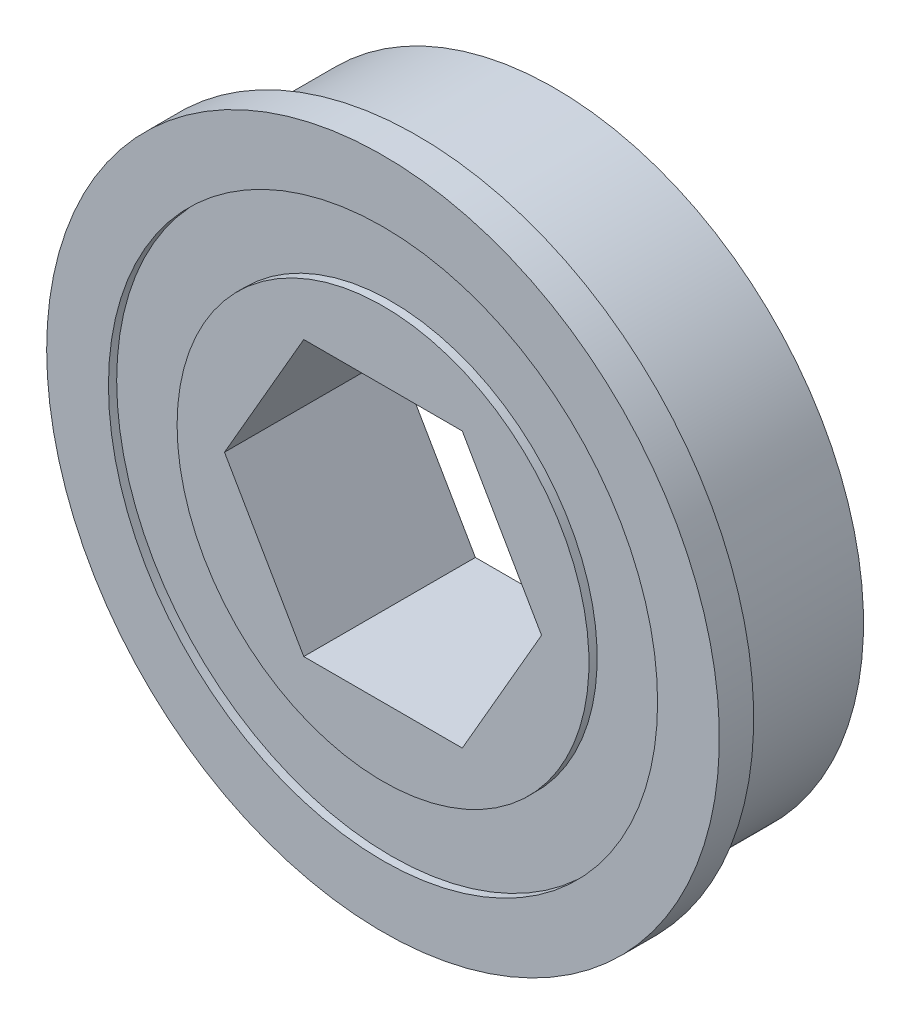
ISO-10303-21;
HEADER;
FILE_DESCRIPTION(('STEP AP214'),'2;1');
FILE_NAME('part.step','',(''),(''),'','','');
FILE_SCHEMA(('AUTOMOTIVE_DESIGN { 1 0 10303 214 1 1 1 1 }'));
ENDSEC;
DATA;
#1=APPLICATION_CONTEXT('core data for automotive mechanical design processes');
#2=APPLICATION_PROTOCOL_DEFINITION('international standard','automotive_design',2000,#1);
#3=PRODUCT_CONTEXT('',#1,'mechanical');
#4=PRODUCT('Part','Part','',(#3));
#5=PRODUCT_RELATED_PRODUCT_CATEGORY('part','',(#4));
#6=PRODUCT_DEFINITION_FORMATION('','',#4);
#7=PRODUCT_DEFINITION_CONTEXT('part definition',#1,'design');
#8=PRODUCT_DEFINITION('design','',#6,#7);
#9=PRODUCT_DEFINITION_SHAPE('','',#8);
#10=(LENGTH_UNIT() NAMED_UNIT(*) SI_UNIT(.MILLI.,.METRE.));
#11=(NAMED_UNIT(*) PLANE_ANGLE_UNIT() SI_UNIT($,.RADIAN.));
#12=(NAMED_UNIT(*) SI_UNIT($,.STERADIAN.) SOLID_ANGLE_UNIT());
#13=UNCERTAINTY_MEASURE_WITH_UNIT(LENGTH_MEASURE(1.E-05),#10,'distance_accuracy_value','');
#14=(GEOMETRIC_REPRESENTATION_CONTEXT(3) GLOBAL_UNCERTAINTY_ASSIGNED_CONTEXT((#13)) GLOBAL_UNIT_ASSIGNED_CONTEXT((#10,
#11,#12)) REPRESENTATION_CONTEXT('',''));
#15=CARTESIAN_POINT('',(0.,0.,0.));
#16=DIRECTION('',(0.,0.,1.));
#17=DIRECTION('',(1.,0.,0.));
#18=AXIS2_PLACEMENT_3D('',#15,#16,#17);
#19=CARTESIAN_POINT('',(7.9375,0.,0.));
#20=DIRECTION('',(0.,0.,1.));
#21=DIRECTION('',(1.,0.,0.));
#22=AXIS2_PLACEMENT_3D('',#19,#20,#21);
#23=PLANE('',#22);
#24=DIRECTION('',(0.5,0.866025403784438,0.));
#25=VECTOR('',#24,1.);
#26=CARTESIAN_POINT('',(7.48363631403119,0.262038321269491,0.));
#27=LINE('',#26,#25);
#28=CARTESIAN_POINT('',(3.66617420935412,-6.35,0.));
#29=VERTEX_POINT('',#28);
#30=CARTESIAN_POINT('',(7.33234841870825,0.,0.));
#31=VERTEX_POINT('',#30);
#32=EDGE_CURVE('E32',#29,#31,#27,.T.);
#33=ORIENTED_EDGE('',*,*,#32,.T.);
#34=DIRECTION('',(-0.5,0.866025403784439,0.));
#35=VECTOR('',#34,1.);
#36=CARTESIAN_POINT('',(7.48363631403119,-0.262038321269491,0.));
#37=LINE('',#36,#35);
#38=CARTESIAN_POINT('',(3.66617420935412,6.35,0.));
#39=VERTEX_POINT('',#38);
#40=EDGE_CURVE('E116',#31,#39,#37,.T.);
#41=ORIENTED_EDGE('',*,*,#40,.T.);
#42=DIRECTION('',(-1.,0.,0.));
#43=VECTOR('',#42,1.);
#44=CARTESIAN_POINT('',(7.9375,6.35,0.));
#45=LINE('',#44,#43);
#46=CARTESIAN_POINT('',(-3.66617420935412,6.35,0.));
#47=VERTEX_POINT('',#46);
#48=EDGE_CURVE('E113',#39,#47,#45,.T.);
#49=ORIENTED_EDGE('',*,*,#48,.T.);
#50=DIRECTION('',(-0.5,-0.866025403784439,0.));
#51=VECTOR('',#50,1.);
#52=CARTESIAN_POINT('',(-3.51488631403119,6.61203832126949,0.));
#53=LINE('',#52,#51);
#54=CARTESIAN_POINT('',(-7.33234841870825,0.,0.));
#55=VERTEX_POINT('',#54);
#56=EDGE_CURVE('E110',#47,#55,#53,.T.);
#57=ORIENTED_EDGE('',*,*,#56,.T.);
#58=DIRECTION('',(0.5,-0.866025403784439,0.));
#59=VECTOR('',#58,1.);
#60=CARTESIAN_POINT('',(-3.51488631403119,-6.61203832126949,0.));
#61=LINE('',#60,#59);
#62=CARTESIAN_POINT('',(-3.66617420935412,-6.35,0.));
#63=VERTEX_POINT('',#62);
#64=EDGE_CURVE('E71',#55,#63,#61,.T.);
#65=ORIENTED_EDGE('',*,*,#64,.T.);
#66=DIRECTION('',(1.,0.,0.));
#67=VECTOR('',#66,1.);
#68=CARTESIAN_POINT('',(7.9375,-6.35,0.));
#69=LINE('',#68,#67);
#70=EDGE_CURVE('E68',#63,#29,#69,.T.);
#71=ORIENTED_EDGE('',*,*,#70,.T.);
#72=EDGE_LOOP('',(#33,#41,#49,#57,#65,#71));
#73=FACE_BOUND('',#72,.T.);
#74=CARTESIAN_POINT('',(0.,0.,0.));
#75=DIRECTION('',(0.,0.,-1.));
#76=DIRECTION('',(-1.,0.,0.));
#77=AXIS2_PLACEMENT_3D('',#74,#75,#76);
#78=CIRCLE('',#77,9.525);
#79=CARTESIAN_POINT('',(-9.525,0.,0.));
#80=VERTEX_POINT('',#79);
#81=EDGE_CURVE('E163',#80,#80,#78,.T.);
#82=ORIENTED_EDGE('',*,*,#81,.T.);
#83=EDGE_LOOP('',(#82));
#84=FACE_BOUND('',#83,.T.);
#85=ADVANCED_FACE('F17',(#73,#84),#23,.F.);
#86=CARTESIAN_POINT('',(0.,0.,0.));
#87=DIRECTION('',(0.,0.,-1.));
#88=DIRECTION('',(-1.,0.,0.));
#89=AXIS2_PLACEMENT_3D('',#86,#87,#88);
#90=CYLINDRICAL_SURFACE('',#89,9.525);
#91=ORIENTED_EDGE('',*,*,#81,.F.);
#92=EDGE_LOOP('',(#91));
#93=FACE_BOUND('',#92,.T.);
#94=CARTESIAN_POINT('',(0.,0.,0.381));
#95=DIRECTION('',(0.,0.,-1.));
#96=DIRECTION('',(-1.,0.,0.));
#97=AXIS2_PLACEMENT_3D('',#94,#95,#96);
#98=CIRCLE('',#97,9.525);
#99=CARTESIAN_POINT('',(-9.525,0.,0.381));
#100=VERTEX_POINT('',#99);
#101=EDGE_CURVE('E159',#100,#100,#98,.T.);
#102=ORIENTED_EDGE('',*,*,#101,.T.);
#103=EDGE_LOOP('',(#102));
#104=FACE_BOUND('',#103,.T.);
#105=ADVANCED_FACE('F207',(#93,#104),#90,.T.);
#106=CARTESIAN_POINT('',(11.1125,0.,0.381));
#107=DIRECTION('',(0.,0.,1.));
#108=DIRECTION('',(1.,0.,0.));
#109=AXIS2_PLACEMENT_3D('',#106,#107,#108);
#110=PLANE('',#109);
#111=ORIENTED_EDGE('',*,*,#101,.F.);
#112=EDGE_LOOP('',(#111));
#113=FACE_BOUND('',#112,.T.);
#114=CARTESIAN_POINT('',(0.,0.,0.381));
#115=DIRECTION('',(0.,0.,-1.));
#116=DIRECTION('',(-1.,0.,0.));
#117=AXIS2_PLACEMENT_3D('',#114,#115,#116);
#118=CIRCLE('',#117,12.7);
#119=CARTESIAN_POINT('',(-12.7,0.,0.381));
#120=VERTEX_POINT('',#119);
#121=EDGE_CURVE('E155',#120,#120,#118,.T.);
#122=ORIENTED_EDGE('',*,*,#121,.T.);
#123=EDGE_LOOP('',(#122));
#124=FACE_BOUND('',#123,.T.);
#125=ADVANCED_FACE('F210',(#113,#124),#110,.F.);
#126=CARTESIAN_POINT('',(0.,0.,0.));
#127=DIRECTION('',(0.,0.,-1.));
#128=DIRECTION('',(-1.,0.,0.));
#129=AXIS2_PLACEMENT_3D('',#126,#127,#128);
#130=CYLINDRICAL_SURFACE('',#129,12.7);
#131=ORIENTED_EDGE('',*,*,#121,.F.);
#132=EDGE_LOOP('',(#131));
#133=FACE_BOUND('',#132,.T.);
#134=CARTESIAN_POINT('',(0.,0.,0.));
#135=DIRECTION('',(0.,0.,-1.));
#136=DIRECTION('',(-1.,0.,0.));
#137=AXIS2_PLACEMENT_3D('',#134,#135,#136);
#138=CIRCLE('',#137,12.7);
#139=CARTESIAN_POINT('',(-12.7,0.,0.));
#140=VERTEX_POINT('',#139);
#141=EDGE_CURVE('E151',#140,#140,#138,.T.);
#142=ORIENTED_EDGE('',*,*,#141,.T.);
#143=EDGE_LOOP('',(#142));
#144=FACE_BOUND('',#143,.T.);
#145=ADVANCED_FACE('F215',(#133,#144),#130,.F.);
#146=CARTESIAN_POINT('',(13.49375,0.,0.));
#147=DIRECTION('',(0.,0.,1.));
#148=DIRECTION('',(1.,0.,0.));
#149=AXIS2_PLACEMENT_3D('',#146,#147,#148);
#150=PLANE('',#149);
#151=ORIENTED_EDGE('',*,*,#141,.F.);
#152=EDGE_LOOP('',(#151));
#153=FACE_BOUND('',#152,.T.);
#154=CARTESIAN_POINT('',(0.,0.,0.));
#155=DIRECTION('',(0.,0.,-1.));
#156=DIRECTION('',(-1.,0.,0.));
#157=AXIS2_PLACEMENT_3D('',#154,#155,#156);
#158=CIRCLE('',#157,14.2875);
#159=CARTESIAN_POINT('',(-14.2875,0.,0.));
#160=VERTEX_POINT('',#159);
#161=EDGE_CURVE('E147',#160,#160,#158,.T.);
#162=ORIENTED_EDGE('',*,*,#161,.T.);
#163=EDGE_LOOP('',(#162));
#164=FACE_BOUND('',#163,.T.);
#165=ADVANCED_FACE('F223',(#153,#164),#150,.F.);
#166=CARTESIAN_POINT('',(0.,0.,0.));
#167=DIRECTION('',(0.,0.,-1.));
#168=DIRECTION('',(-1.,0.,0.));
#169=AXIS2_PLACEMENT_3D('',#166,#167,#168);
#170=CYLINDRICAL_SURFACE('',#169,14.2875);
#171=ORIENTED_EDGE('',*,*,#161,.F.);
#172=EDGE_LOOP('',(#171));
#173=FACE_BOUND('',#172,.T.);
#174=CARTESIAN_POINT('',(0.,0.,6.35));
#175=DIRECTION('',(0.,0.,-1.));
#176=DIRECTION('',(-1.,0.,0.));
#177=AXIS2_PLACEMENT_3D('',#174,#175,#176);
#178=CIRCLE('',#177,14.2875);
#179=CARTESIAN_POINT('',(-14.2875,0.,6.35));
#180=VERTEX_POINT('',#179);
#181=EDGE_CURVE('E143',#180,#180,#178,.T.);
#182=ORIENTED_EDGE('',*,*,#181,.T.);
#183=EDGE_LOOP('',(#182));
#184=FACE_BOUND('',#183,.T.);
#185=ADVANCED_FACE('F227',(#173,#184),#170,.T.);
#186=CARTESIAN_POINT('',(14.9225,0.,6.35));
#187=DIRECTION('',(0.,0.,1.));
#188=DIRECTION('',(1.,0.,0.));
#189=AXIS2_PLACEMENT_3D('',#186,#187,#188);
#190=PLANE('',#189);
#191=ORIENTED_EDGE('',*,*,#181,.F.);
#192=EDGE_LOOP('',(#191));
#193=FACE_BOUND('',#192,.T.);
#194=CARTESIAN_POINT('',(0.,0.,6.35));
#195=DIRECTION('',(0.,0.,-1.));
#196=DIRECTION('',(-1.,0.,0.));
#197=AXIS2_PLACEMENT_3D('',#194,#195,#196);
#198=CIRCLE('',#197,15.5575);
#199=CARTESIAN_POINT('',(-15.5575,0.,6.35));
#200=VERTEX_POINT('',#199);
#201=EDGE_CURVE('E139',#200,#200,#198,.T.);
#202=ORIENTED_EDGE('',*,*,#201,.T.);
#203=EDGE_LOOP('',(#202));
#204=FACE_BOUND('',#203,.T.);
#205=ADVANCED_FACE('F231',(#193,#204),#190,.F.);
#206=CARTESIAN_POINT('',(0.,0.,0.));
#207=DIRECTION('',(0.,0.,-1.));
#208=DIRECTION('',(-1.,0.,0.));
#209=AXIS2_PLACEMENT_3D('',#206,#207,#208);
#210=CYLINDRICAL_SURFACE('',#209,15.5575);
#211=ORIENTED_EDGE('',*,*,#201,.F.);
#212=EDGE_LOOP('',(#211));
#213=FACE_BOUND('',#212,.T.);
#214=CARTESIAN_POINT('',(0.,0.,7.9375));
#215=DIRECTION('',(0.,0.,-1.));
#216=DIRECTION('',(-1.,0.,0.));
#217=AXIS2_PLACEMENT_3D('',#214,#215,#216);
#218=CIRCLE('',#217,15.5575);
#219=CARTESIAN_POINT('',(-15.5575,0.,7.9375));
#220=VERTEX_POINT('',#219);
#221=EDGE_CURVE('E135',#220,#220,#218,.T.);
#222=ORIENTED_EDGE('',*,*,#221,.T.);
#223=EDGE_LOOP('',(#222));
#224=FACE_BOUND('',#223,.T.);
#225=ADVANCED_FACE('F235',(#213,#224),#210,.T.);
#226=CARTESIAN_POINT('',(14.12875,0.,7.9375));
#227=DIRECTION('',(0.,0.,-1.));
#228=DIRECTION('',(-1.,0.,0.));
#229=AXIS2_PLACEMENT_3D('',#226,#227,#228);
#230=PLANE('',#229);
#231=ORIENTED_EDGE('',*,*,#221,.F.);
#232=EDGE_LOOP('',(#231));
#233=FACE_BOUND('',#232,.T.);
#234=CARTESIAN_POINT('',(0.,0.,7.9375));
#235=DIRECTION('',(0.,0.,-1.));
#236=DIRECTION('',(-1.,0.,0.));
#237=AXIS2_PLACEMENT_3D('',#234,#235,#236);
#238=CIRCLE('',#237,12.7);
#239=CARTESIAN_POINT('',(-12.7,0.,7.9375));
#240=VERTEX_POINT('',#239);
#241=EDGE_CURVE('E131',#240,#240,#238,.T.);
#242=ORIENTED_EDGE('',*,*,#241,.T.);
#243=EDGE_LOOP('',(#242));
#244=FACE_BOUND('',#243,.T.);
#245=ADVANCED_FACE('F239',(#233,#244),#230,.F.);
#246=CARTESIAN_POINT('',(0.,0.,0.));
#247=DIRECTION('',(0.,0.,-1.));
#248=DIRECTION('',(-1.,0.,0.));
#249=AXIS2_PLACEMENT_3D('',#246,#247,#248);
#250=CYLINDRICAL_SURFACE('',#249,12.7);
#251=ORIENTED_EDGE('',*,*,#241,.F.);
#252=EDGE_LOOP('',(#251));
#253=FACE_BOUND('',#252,.T.);
#254=CARTESIAN_POINT('',(0.,0.,7.5565));
#255=DIRECTION('',(0.,0.,-1.));
#256=DIRECTION('',(-1.,0.,0.));
#257=AXIS2_PLACEMENT_3D('',#254,#255,#256);
#258=CIRCLE('',#257,12.7);
#259=CARTESIAN_POINT('',(-12.7,0.,7.5565));
#260=VERTEX_POINT('',#259);
#261=EDGE_CURVE('E127',#260,#260,#258,.T.);
#262=ORIENTED_EDGE('',*,*,#261,.T.);
#263=EDGE_LOOP('',(#262));
#264=FACE_BOUND('',#263,.T.);
#265=ADVANCED_FACE('F243',(#253,#264),#250,.F.);
#266=CARTESIAN_POINT('',(11.1125,0.,7.5565));
#267=DIRECTION('',(0.,0.,-1.));
#268=DIRECTION('',(-1.,0.,0.));
#269=AXIS2_PLACEMENT_3D('',#266,#267,#268);
#270=PLANE('',#269);
#271=ORIENTED_EDGE('',*,*,#261,.F.);
#272=EDGE_LOOP('',(#271));
#273=FACE_BOUND('',#272,.T.);
#274=CARTESIAN_POINT('',(0.,0.,7.5565));
#275=DIRECTION('',(0.,0.,-1.));
#276=DIRECTION('',(-1.,0.,0.));
#277=AXIS2_PLACEMENT_3D('',#274,#275,#276);
#278=CIRCLE('',#277,9.525);
#279=CARTESIAN_POINT('',(-9.525,0.,7.5565));
#280=VERTEX_POINT('',#279);
#281=EDGE_CURVE('E123',#280,#280,#278,.T.);
#282=ORIENTED_EDGE('',*,*,#281,.T.);
#283=EDGE_LOOP('',(#282));
#284=FACE_BOUND('',#283,.T.);
#285=ADVANCED_FACE('F247',(#273,#284),#270,.F.);
#286=CARTESIAN_POINT('',(0.,0.,0.));
#287=DIRECTION('',(0.,0.,-1.));
#288=DIRECTION('',(-1.,0.,0.));
#289=AXIS2_PLACEMENT_3D('',#286,#287,#288);
#290=CYLINDRICAL_SURFACE('',#289,9.525);
#291=ORIENTED_EDGE('',*,*,#281,.F.);
#292=EDGE_LOOP('',(#291));
#293=FACE_BOUND('',#292,.T.);
#294=CARTESIAN_POINT('',(0.,0.,7.9375));
#295=DIRECTION('',(0.,0.,-1.));
#296=DIRECTION('',(-1.,0.,0.));
#297=AXIS2_PLACEMENT_3D('',#294,#295,#296);
#298=CIRCLE('',#297,9.525);
#299=CARTESIAN_POINT('',(-9.525,0.,7.9375));
#300=VERTEX_POINT('',#299);
#301=EDGE_CURVE('E119',#300,#300,#298,.T.);
#302=ORIENTED_EDGE('',*,*,#301,.T.);
#303=EDGE_LOOP('',(#302));
#304=FACE_BOUND('',#303,.T.);
#305=ADVANCED_FACE('F203',(#293,#304),#290,.T.);
#306=CARTESIAN_POINT('',(7.9375,0.,7.9375));
#307=DIRECTION('',(0.,0.,-1.));
#308=DIRECTION('',(-1.,0.,0.));
#309=AXIS2_PLACEMENT_3D('',#306,#307,#308);
#310=PLANE('',#309);
#311=ORIENTED_EDGE('',*,*,#301,.F.);
#312=EDGE_LOOP('',(#311));
#313=FACE_BOUND('',#312,.T.);
#314=DIRECTION('',(-0.5,0.866025403784439,0.));
#315=VECTOR('',#314,1.);
#316=CARTESIAN_POINT('',(-3.51488631403119,-6.61203832126949,7.9375));
#317=LINE('',#316,#315);
#318=CARTESIAN_POINT('',(-3.66617420935412,-6.35,7.9375));
#319=VERTEX_POINT('',#318);
#320=CARTESIAN_POINT('',(-7.33234841870825,0.,7.9375));
#321=VERTEX_POINT('',#320);
#322=EDGE_CURVE('E175',#319,#321,#317,.T.);
#323=ORIENTED_EDGE('',*,*,#322,.T.);
#324=DIRECTION('',(0.5,0.866025403784439,0.));
#325=VECTOR('',#324,1.);
#326=CARTESIAN_POINT('',(-3.51488631403119,6.61203832126949,7.9375));
#327=LINE('',#326,#325);
#328=CARTESIAN_POINT('',(-3.66617420935412,6.35,7.9375));
#329=VERTEX_POINT('',#328);
#330=EDGE_CURVE('E11',#321,#329,#327,.T.);
#331=ORIENTED_EDGE('',*,*,#330,.T.);
#332=DIRECTION('',(1.,0.,0.));
#333=VECTOR('',#332,1.);
#334=CARTESIAN_POINT('',(7.9375,6.35,7.9375));
#335=LINE('',#334,#333);
#336=CARTESIAN_POINT('',(3.66617420935412,6.35,7.9375));
#337=VERTEX_POINT('',#336);
#338=EDGE_CURVE('E25',#329,#337,#335,.T.);
#339=ORIENTED_EDGE('',*,*,#338,.T.);
#340=DIRECTION('',(0.5,-0.866025403784439,0.));
#341=VECTOR('',#340,1.);
#342=CARTESIAN_POINT('',(7.48363631403119,-0.26203832126949,7.9375));
#343=LINE('',#342,#341);
#344=CARTESIAN_POINT('',(7.33234841870825,0.,7.9375));
#345=VERTEX_POINT('',#344);
#346=EDGE_CURVE('E171',#337,#345,#343,.T.);
#347=ORIENTED_EDGE('',*,*,#346,.T.);
#348=DIRECTION('',(-0.5,-0.866025403784438,0.));
#349=VECTOR('',#348,1.);
#350=CARTESIAN_POINT('',(7.48363631403119,0.26203832126949,7.9375));
#351=LINE('',#350,#349);
#352=CARTESIAN_POINT('',(3.66617420935412,-6.35,7.9375));
#353=VERTEX_POINT('',#352);
#354=EDGE_CURVE('E167',#345,#353,#351,.T.);
#355=ORIENTED_EDGE('',*,*,#354,.T.);
#356=DIRECTION('',(-1.,0.,0.));
#357=VECTOR('',#356,1.);
#358=CARTESIAN_POINT('',(7.9375,-6.35,7.9375));
#359=LINE('',#358,#357);
#360=EDGE_CURVE('E85',#353,#319,#359,.T.);
#361=ORIENTED_EDGE('',*,*,#360,.T.);
#362=EDGE_LOOP('',(#323,#331,#339,#347,#355,#361));
#363=FACE_BOUND('',#362,.T.);
#364=ADVANCED_FACE('F181',(#313,#363),#310,.F.);
#365=CARTESIAN_POINT('',(5.49926131403119,3.175,-44.7234247877525));
#366=DIRECTION('',(0.866025403784439,0.5,0.));
#367=DIRECTION('',(-0.5,0.866025403784439,0.));
#368=AXIS2_PLACEMENT_3D('',#365,#366,#367);
#369=PLANE('',#368);
#370=ORIENTED_EDGE('',*,*,#40,.F.);
#371=DIRECTION('',(0.,0.,1.));
#372=VECTOR('',#371,1.);
#373=CARTESIAN_POINT('',(7.33234841870825,0.,-44.7234247877525));
#374=LINE('',#373,#372);
#375=EDGE_CURVE('E79',#31,#345,#374,.T.);
#376=ORIENTED_EDGE('',*,*,#375,.T.);
#377=ORIENTED_EDGE('',*,*,#346,.F.);
#378=DIRECTION('',(0.,0.,1.));
#379=VECTOR('',#378,1.);
#380=CARTESIAN_POINT('',(3.66617420935412,6.35,-44.7234247877525));
#381=LINE('',#380,#379);
#382=EDGE_CURVE('E82',#39,#337,#381,.T.);
#383=ORIENTED_EDGE('',*,*,#382,.F.);
#384=EDGE_LOOP('',(#370,#376,#377,#383));
#385=FACE_BOUND('',#384,.T.);
#386=ADVANCED_FACE('F195',(#385),#369,.F.);
#387=CARTESIAN_POINT('',(0.,6.35,-44.7234247877525));
#388=DIRECTION('',(0.,1.,0.));
#389=DIRECTION('',(0.,0.,1.));
#390=AXIS2_PLACEMENT_3D('',#387,#388,#389);
#391=PLANE('',#390);
#392=ORIENTED_EDGE('',*,*,#48,.F.);
#393=ORIENTED_EDGE('',*,*,#382,.T.);
#394=ORIENTED_EDGE('',*,*,#338,.F.);
#395=DIRECTION('',(0.,0.,1.));
#396=VECTOR('',#395,1.);
#397=CARTESIAN_POINT('',(-3.66617420935412,6.35,-44.7234247877525));
#398=LINE('',#397,#396);
#399=EDGE_CURVE('E101',#47,#329,#398,.T.);
#400=ORIENTED_EDGE('',*,*,#399,.F.);
#401=EDGE_LOOP('',(#392,#393,#394,#400));
#402=FACE_BOUND('',#401,.T.);
#403=ADVANCED_FACE('F185',(#402),#391,.F.);
#404=CARTESIAN_POINT('',(-5.49926131403119,3.175,-44.7234247877525));
#405=DIRECTION('',(-0.866025403784439,0.5,0.));
#406=DIRECTION('',(-0.5,-0.866025403784439,0.));
#407=AXIS2_PLACEMENT_3D('',#404,#405,#406);
#408=PLANE('',#407);
#409=ORIENTED_EDGE('',*,*,#56,.F.);
#410=ORIENTED_EDGE('',*,*,#399,.T.);
#411=ORIENTED_EDGE('',*,*,#330,.F.);
#412=DIRECTION('',(0.,0.,1.));
#413=VECTOR('',#412,1.);
#414=CARTESIAN_POINT('',(-7.33234841870825,0.,-44.7234247877525));
#415=LINE('',#414,#413);
#416=EDGE_CURVE('E93',#55,#321,#415,.T.);
#417=ORIENTED_EDGE('',*,*,#416,.F.);
#418=EDGE_LOOP('',(#409,#410,#411,#417));
#419=FACE_BOUND('',#418,.T.);
#420=ADVANCED_FACE('F189',(#419),#408,.F.);
#421=CARTESIAN_POINT('',(-5.49926131403119,-3.175,-44.7234247877525));
#422=DIRECTION('',(-0.866025403784439,-0.5,0.));
#423=DIRECTION('',(0.5,-0.866025403784439,0.));
#424=AXIS2_PLACEMENT_3D('',#421,#422,#423);
#425=PLANE('',#424);
#426=ORIENTED_EDGE('',*,*,#64,.F.);
#427=ORIENTED_EDGE('',*,*,#416,.T.);
#428=ORIENTED_EDGE('',*,*,#322,.F.);
#429=DIRECTION('',(0.,0.,1.));
#430=VECTOR('',#429,1.);
#431=CARTESIAN_POINT('',(-3.66617420935412,-6.35,-44.7234247877525));
#432=LINE('',#431,#430);
#433=EDGE_CURVE('E88',#63,#319,#432,.T.);
#434=ORIENTED_EDGE('',*,*,#433,.F.);
#435=EDGE_LOOP('',(#426,#427,#428,#434));
#436=FACE_BOUND('',#435,.T.);
#437=ADVANCED_FACE('F192',(#436),#425,.F.);
#438=CARTESIAN_POINT('',(0.,-6.35,-44.7234247877525));
#439=DIRECTION('',(0.,-1.,0.));
#440=DIRECTION('',(0.,0.,-1.));
#441=AXIS2_PLACEMENT_3D('',#438,#439,#440);
#442=PLANE('',#441);
#443=ORIENTED_EDGE('',*,*,#70,.F.);
#444=ORIENTED_EDGE('',*,*,#433,.T.);
#445=ORIENTED_EDGE('',*,*,#360,.F.);
#446=DIRECTION('',(0.,0.,1.));
#447=VECTOR('',#446,1.);
#448=CARTESIAN_POINT('',(3.66617420935412,-6.35,-44.7234247877525));
#449=LINE('',#448,#447);
#450=EDGE_CURVE('E39',#29,#353,#449,.T.);
#451=ORIENTED_EDGE('',*,*,#450,.F.);
#452=EDGE_LOOP('',(#443,#444,#445,#451));
#453=FACE_BOUND('',#452,.T.);
#454=ADVANCED_FACE('F84',(#453),#442,.F.);
#455=CARTESIAN_POINT('',(5.49926131403119,-3.175,-44.7234247877525));
#456=DIRECTION('',(0.866025403784438,-0.5,0.));
#457=DIRECTION('',(0.5,0.866025403784438,0.));
#458=AXIS2_PLACEMENT_3D('',#455,#456,#457);
#459=PLANE('',#458);
#460=ORIENTED_EDGE('',*,*,#32,.F.);
#461=ORIENTED_EDGE('',*,*,#450,.T.);
#462=ORIENTED_EDGE('',*,*,#354,.F.);
#463=ORIENTED_EDGE('',*,*,#375,.F.);
#464=EDGE_LOOP('',(#460,#461,#462,#463));
#465=FACE_BOUND('',#464,.T.);
#466=ADVANCED_FACE('F77',(#465),#459,.F.);
#467=CLOSED_SHELL('',(#85,#105,#125,#145,#165,#185,#205,#225,#245,#265,#285,#305,#364,#386,#403,
#420,#437,#454,#466));
#468=MANIFOLD_SOLID_BREP('B1',#467);
#469=ADVANCED_BREP_SHAPE_REPRESENTATION('',(#18,#468),#14);
#470=SHAPE_DEFINITION_REPRESENTATION(#9,#469);
ENDSEC;
END-ISO-10303-21;
